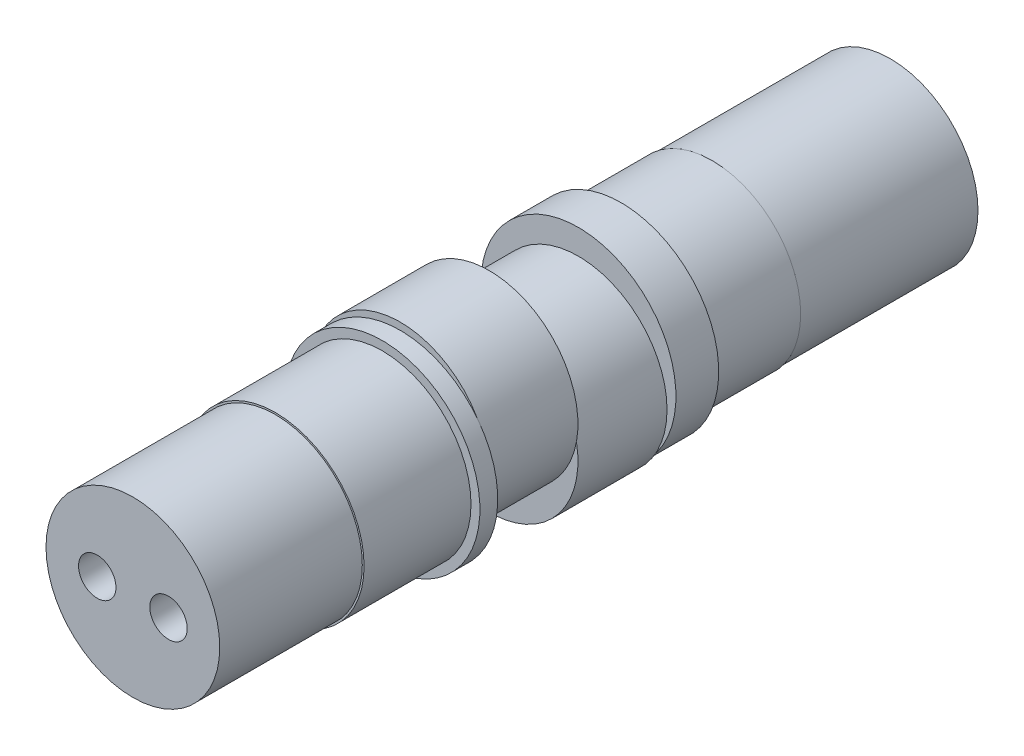
ISO-10303-21;
HEADER;
FILE_DESCRIPTION(('STEP AP214'),'2;1');
FILE_NAME('part.step','',(''),(''),'','','');
FILE_SCHEMA(('AUTOMOTIVE_DESIGN { 1 0 10303 214 1 1 1 1 }'));
ENDSEC;
DATA;
#1=APPLICATION_CONTEXT('core data for automotive mechanical design processes');
#2=APPLICATION_PROTOCOL_DEFINITION('international standard','automotive_design',2000,#1);
#3=PRODUCT_CONTEXT('',#1,'mechanical');
#4=PRODUCT('Part','Part','',(#3));
#5=PRODUCT_RELATED_PRODUCT_CATEGORY('part','',(#4));
#6=PRODUCT_DEFINITION_FORMATION('','',#4);
#7=PRODUCT_DEFINITION_CONTEXT('part definition',#1,'design');
#8=PRODUCT_DEFINITION('design','',#6,#7);
#9=PRODUCT_DEFINITION_SHAPE('','',#8);
#10=(LENGTH_UNIT() NAMED_UNIT(*) SI_UNIT(.MILLI.,.METRE.));
#11=(NAMED_UNIT(*) PLANE_ANGLE_UNIT() SI_UNIT($,.RADIAN.));
#12=(NAMED_UNIT(*) SI_UNIT($,.STERADIAN.) SOLID_ANGLE_UNIT());
#13=UNCERTAINTY_MEASURE_WITH_UNIT(LENGTH_MEASURE(1.E-05),#10,'distance_accuracy_value','');
#14=(GEOMETRIC_REPRESENTATION_CONTEXT(3) GLOBAL_UNCERTAINTY_ASSIGNED_CONTEXT((#13)) GLOBAL_UNIT_ASSIGNED_CONTEXT((#10,
#11,#12)) REPRESENTATION_CONTEXT('',''));
#15=CARTESIAN_POINT('',(0.,0.,0.));
#16=DIRECTION('',(0.,0.,1.));
#17=DIRECTION('',(1.,0.,0.));
#18=AXIS2_PLACEMENT_3D('',#15,#16,#17);
#19=CARTESIAN_POINT('',(-10.96,-23.586225741973,-27.5));
#20=DIRECTION('',(0.,0.,-1.));
#21=DIRECTION('',(-1.,0.,0.));
#22=AXIS2_PLACEMENT_3D('',#19,#20,#21);
#23=PLANE('',#22);
#24=CARTESIAN_POINT('',(4.,0.,-27.5));
#25=DIRECTION('',(0.,0.,-1.));
#26=DIRECTION('',(-1.,0.,0.));
#27=AXIS2_PLACEMENT_3D('',#24,#25,#26);
#28=CIRCLE('',#27,2.1);
#29=CARTESIAN_POINT('',(1.9,0.,-27.5));
#30=VERTEX_POINT('',#29);
#31=EDGE_CURVE('E91',#30,#30,#28,.F.);
#32=ORIENTED_EDGE('',*,*,#31,.T.);
#33=EDGE_LOOP('',(#32));
#34=FACE_BOUND('',#33,.T.);
#35=CARTESIAN_POINT('',(-4.,0.,-27.5));
#36=DIRECTION('',(0.,0.,-1.));
#37=DIRECTION('',(-1.,0.,0.));
#38=AXIS2_PLACEMENT_3D('',#35,#36,#37);
#39=CIRCLE('',#38,2.1);
#40=CARTESIAN_POINT('',(-6.1,0.,-27.5));
#41=VERTEX_POINT('',#40);
#42=EDGE_CURVE('E60',#41,#41,#39,.F.);
#43=ORIENTED_EDGE('',*,*,#42,.T.);
#44=EDGE_LOOP('',(#43));
#45=FACE_BOUND('',#44,.T.);
#46=CARTESIAN_POINT('',(0.,-1.8,-27.5));
#47=DIRECTION('',(0.,0.,1.));
#48=DIRECTION('',(1.,0.,0.));
#49=AXIS2_PLACEMENT_3D('',#46,#47,#48);
#50=CIRCLE('',#49,9.95);
#51=CARTESIAN_POINT('',(9.95,-1.8,-27.5));
#52=VERTEX_POINT('',#51);
#53=EDGE_CURVE('E94',#52,#52,#50,.T.);
#54=ORIENTED_EDGE('',*,*,#53,.F.);
#55=EDGE_LOOP('',(#54));
#56=FACE_BOUND('',#55,.T.);
#57=ADVANCED_FACE('F56',(#34,#45,#56),#23,.T.);
#58=CARTESIAN_POINT('',(-4.,0.,-42.5));
#59=DIRECTION('',(0.,0.,1.));
#60=DIRECTION('',(1.,0.,0.));
#61=AXIS2_PLACEMENT_3D('',#58,#59,#60);
#62=CYLINDRICAL_SURFACE('',#61,2.1);
#63=CARTESIAN_POINT('',(-4.,0.,-7.5));
#64=DIRECTION('',(0.,0.,-1.));
#65=DIRECTION('',(-1.,0.,0.));
#66=AXIS2_PLACEMENT_3D('',#63,#64,#65);
#67=CIRCLE('',#66,2.1);
#68=CARTESIAN_POINT('',(-6.1,0.,-7.5));
#69=VERTEX_POINT('',#68);
#70=EDGE_CURVE('E65',#69,#69,#67,.T.);
#71=ORIENTED_EDGE('',*,*,#70,.F.);
#72=EDGE_LOOP('',(#71));
#73=FACE_BOUND('',#72,.T.);
#74=ORIENTED_EDGE('',*,*,#42,.F.);
#75=EDGE_LOOP('',(#74));
#76=FACE_BOUND('',#75,.T.);
#77=ADVANCED_FACE('F108',(#73,#76),#62,.F.);
#78=CARTESIAN_POINT('',(4.,0.,-42.5));
#79=DIRECTION('',(0.,0.,1.));
#80=DIRECTION('',(1.,0.,0.));
#81=AXIS2_PLACEMENT_3D('',#78,#79,#80);
#82=CYLINDRICAL_SURFACE('',#81,2.1);
#83=CARTESIAN_POINT('',(4.,0.,-7.5));
#84=DIRECTION('',(0.,0.,-1.));
#85=DIRECTION('',(-1.,0.,0.));
#86=AXIS2_PLACEMENT_3D('',#83,#84,#85);
#87=CIRCLE('',#86,2.1);
#88=CARTESIAN_POINT('',(1.9,0.,-7.5));
#89=VERTEX_POINT('',#88);
#90=EDGE_CURVE('E12',#89,#89,#87,.T.);
#91=ORIENTED_EDGE('',*,*,#90,.F.);
#92=EDGE_LOOP('',(#91));
#93=FACE_BOUND('',#92,.T.);
#94=ORIENTED_EDGE('',*,*,#31,.F.);
#95=EDGE_LOOP('',(#94));
#96=FACE_BOUND('',#95,.T.);
#97=ADVANCED_FACE('F58',(#93,#96),#82,.F.);
#98=CARTESIAN_POINT('',(0.,1.8,-17.5));
#99=DIRECTION('',(0.,0.,-1.));
#100=DIRECTION('',(-1.,0.,0.));
#101=AXIS2_PLACEMENT_3D('',#98,#99,#100);
#102=PLANE('',#101);
#103=CARTESIAN_POINT('',(0.,-1.8,-17.5));
#104=DIRECTION('',(0.,0.,-1.));
#105=DIRECTION('',(-1.,0.,0.));
#106=AXIS2_PLACEMENT_3D('',#103,#104,#105);
#107=CIRCLE('',#106,9.95);
#108=CARTESIAN_POINT('',(9.78583159470875,0.,-17.5));
#109=VERTEX_POINT('',#108);
#110=CARTESIAN_POINT('',(-9.78583159470875,0.,-17.5));
#111=VERTEX_POINT('',#110);
#112=EDGE_CURVE('E83',#109,#111,#107,.T.);
#113=ORIENTED_EDGE('',*,*,#112,.F.);
#114=CARTESIAN_POINT('',(0.,1.8,-17.5));
#115=DIRECTION('',(0.,0.,-1.));
#116=DIRECTION('',(-1.,0.,0.));
#117=AXIS2_PLACEMENT_3D('',#114,#115,#116);
#118=CIRCLE('',#117,9.95);
#119=EDGE_CURVE('E72',#109,#111,#118,.T.);
#120=ORIENTED_EDGE('',*,*,#119,.T.);
#121=EDGE_LOOP('',(#113,#120));
#122=FACE_BOUND('',#121,.T.);
#123=ADVANCED_FACE('F90',(#122),#102,.F.);
#124=CARTESIAN_POINT('',(0.,1.8,-17.5));
#125=DIRECTION('',(0.,0.,-1.));
#126=DIRECTION('',(-1.,0.,0.));
#127=AXIS2_PLACEMENT_3D('',#124,#125,#126);
#128=PLANE('',#127);
#129=EDGE_CURVE('E77',#111,#109,#107,.T.);
#130=ORIENTED_EDGE('',*,*,#129,.F.);
#131=EDGE_CURVE('E79',#111,#109,#118,.T.);
#132=ORIENTED_EDGE('',*,*,#131,.T.);
#133=EDGE_LOOP('',(#130,#132));
#134=FACE_BOUND('',#133,.T.);
#135=ADVANCED_FACE('F78',(#134),#128,.T.);
#136=CARTESIAN_POINT('',(0.,-1.8,10.6428498912246));
#137=DIRECTION('',(0.,0.,-1.));
#138=DIRECTION('',(-1.,0.,0.));
#139=AXIS2_PLACEMENT_3D('',#136,#137,#138);
#140=CYLINDRICAL_SURFACE('',#139,9.95);
#141=ORIENTED_EDGE('',*,*,#129,.T.);
#142=ORIENTED_EDGE('',*,*,#112,.T.);
#143=EDGE_LOOP('',(#141,#142));
#144=FACE_BOUND('',#143,.T.);
#145=ORIENTED_EDGE('',*,*,#53,.T.);
#146=EDGE_LOOP('',(#145));
#147=FACE_BOUND('',#146,.T.);
#148=ADVANCED_FACE('F92',(#144,#147),#140,.T.);
#149=CARTESIAN_POINT('',(0.,1.8,-17.5));
#150=DIRECTION('',(0.,0.,1.));
#151=DIRECTION('',(1.,0.,0.));
#152=AXIS2_PLACEMENT_3D('',#149,#150,#151);
#153=CYLINDRICAL_SURFACE('',#152,9.95);
#154=ORIENTED_EDGE('',*,*,#119,.F.);
#155=ORIENTED_EDGE('',*,*,#131,.F.);
#156=EDGE_LOOP('',(#154,#155));
#157=FACE_BOUND('',#156,.T.);
#158=CARTESIAN_POINT('',(0.,1.8,-7.5));
#159=DIRECTION('',(0.,0.,-1.));
#160=DIRECTION('',(-1.,0.,0.));
#161=AXIS2_PLACEMENT_3D('',#158,#159,#160);
#162=CIRCLE('',#161,9.95);
#163=CARTESIAN_POINT('',(-9.95,1.8,-7.5));
#164=VERTEX_POINT('',#163);
#165=EDGE_CURVE('E84',#164,#164,#162,.T.);
#166=ORIENTED_EDGE('',*,*,#165,.T.);
#167=EDGE_LOOP('',(#166));
#168=FACE_BOUND('',#167,.T.);
#169=ADVANCED_FACE('F86',(#157,#168),#153,.T.);
#170=CARTESIAN_POINT('',(0.,1.8,-7.5));
#171=DIRECTION('',(0.,0.,-1.));
#172=DIRECTION('',(-1.,0.,0.));
#173=AXIS2_PLACEMENT_3D('',#170,#171,#172);
#174=PLANE('',#173);
#175=ORIENTED_EDGE('',*,*,#70,.T.);
#176=EDGE_LOOP('',(#175));
#177=FACE_BOUND('',#176,.T.);
#178=ORIENTED_EDGE('',*,*,#90,.T.);
#179=EDGE_LOOP('',(#178));
#180=FACE_BOUND('',#179,.T.);
#181=ORIENTED_EDGE('',*,*,#165,.F.);
#182=EDGE_LOOP('',(#181));
#183=FACE_BOUND('',#182,.T.);
#184=ADVANCED_FACE('F115',(#177,#180,#183),#174,.F.);
#185=CLOSED_SHELL('',(#57,#77,#97,#123,#135,#148,#169,#184));
#186=MANIFOLD_SOLID_BREP('B2',#185);
#187=CARTESIAN_POINT('',(0.,0.,-42.5));
#188=DIRECTION('',(0.,0.,-1.));
#189=DIRECTION('',(-1.,0.,0.));
#190=AXIS2_PLACEMENT_3D('',#187,#188,#189);
#191=PLANE('',#190);
#192=CARTESIAN_POINT('',(-4.,0.,-42.5));
#193=DIRECTION('',(0.,0.,1.));
#194=DIRECTION('',(1.,0.,0.));
#195=AXIS2_PLACEMENT_3D('',#192,#193,#194);
#196=CIRCLE('',#195,2.1);
#197=CARTESIAN_POINT('',(-1.9,0.,-42.5));
#198=VERTEX_POINT('',#197);
#199=EDGE_CURVE('E228',#198,#198,#196,.T.);
#200=ORIENTED_EDGE('',*,*,#199,.T.);
#201=EDGE_LOOP('',(#200));
#202=FACE_BOUND('',#201,.T.);
#203=ADVANCED_FACE('F196',(#202),#191,.F.);
#204=CARTESIAN_POINT('',(-4.,0.,-42.5));
#205=DIRECTION('',(0.,0.,1.));
#206=DIRECTION('',(1.,0.,0.));
#207=AXIS2_PLACEMENT_3D('',#204,#205,#206);
#208=CYLINDRICAL_SURFACE('',#207,2.1);
#209=CARTESIAN_POINT('',(-4.,0.,-27.5));
#210=DIRECTION('',(0.,0.,-1.));
#211=DIRECTION('',(-1.,0.,0.));
#212=AXIS2_PLACEMENT_3D('',#209,#210,#211);
#213=CIRCLE('',#212,2.1);
#214=CARTESIAN_POINT('',(-6.1,0.,-27.5));
#215=VERTEX_POINT('',#214);
#216=EDGE_CURVE('E204',#215,#215,#213,.F.);
#217=ORIENTED_EDGE('',*,*,#216,.T.);
#218=EDGE_LOOP('',(#217));
#219=FACE_BOUND('',#218,.T.);
#220=ORIENTED_EDGE('',*,*,#199,.F.);
#221=EDGE_LOOP('',(#220));
#222=FACE_BOUND('',#221,.T.);
#223=ADVANCED_FACE('F301',(#219,#222),#208,.F.);
#224=CARTESIAN_POINT('',(4.,0.,-42.5));
#225=DIRECTION('',(0.,0.,1.));
#226=DIRECTION('',(1.,0.,0.));
#227=AXIS2_PLACEMENT_3D('',#224,#225,#226);
#228=CIRCLE('',#227,2.1);
#229=CARTESIAN_POINT('',(6.1,0.,-42.5));
#230=VERTEX_POINT('',#229);
#231=EDGE_CURVE('E229',#230,#230,#228,.T.);
#232=ORIENTED_EDGE('',*,*,#231,.T.);
#233=EDGE_LOOP('',(#232));
#234=FACE_BOUND('',#233,.T.);
#235=ADVANCED_FACE('F303',(#234),#191,.F.);
#236=CARTESIAN_POINT('',(4.,0.,-42.5));
#237=DIRECTION('',(0.,0.,1.));
#238=DIRECTION('',(1.,0.,0.));
#239=AXIS2_PLACEMENT_3D('',#236,#237,#238);
#240=CYLINDRICAL_SURFACE('',#239,2.1);
#241=CARTESIAN_POINT('',(4.,0.,-27.5));
#242=DIRECTION('',(0.,0.,-1.));
#243=DIRECTION('',(-1.,0.,0.));
#244=AXIS2_PLACEMENT_3D('',#241,#242,#243);
#245=CIRCLE('',#244,2.1);
#246=CARTESIAN_POINT('',(1.9,0.,-27.5));
#247=VERTEX_POINT('',#246);
#248=EDGE_CURVE('E55',#247,#247,#245,.F.);
#249=ORIENTED_EDGE('',*,*,#248,.T.);
#250=EDGE_LOOP('',(#249));
#251=FACE_BOUND('',#250,.T.);
#252=ORIENTED_EDGE('',*,*,#231,.F.);
#253=EDGE_LOOP('',(#252));
#254=FACE_BOUND('',#253,.T.);
#255=ADVANCED_FACE('F310',(#251,#254),#240,.F.);
#256=CARTESIAN_POINT('',(0.,0.,-27.5));
#257=DIRECTION('',(0.,0.,-1.));
#258=DIRECTION('',(1.,0.,0.));
#259=AXIS2_PLACEMENT_3D('',#256,#257,#258);
#260=PLANE('',#259);
#261=CARTESIAN_POINT('',(0.,0.,-27.5));
#262=DIRECTION('',(0.,0.,-1.));
#263=DIRECTION('',(-1.,0.,0.));
#264=AXIS2_PLACEMENT_3D('',#261,#262,#263);
#265=CIRCLE('',#264,10.95);
#266=CARTESIAN_POINT('',(-10.95,0.,-27.5));
#267=VERTEX_POINT('',#266);
#268=EDGE_CURVE('E214',#267,#267,#265,.T.);
#269=ORIENTED_EDGE('',*,*,#268,.F.);
#270=EDGE_LOOP('',(#269));
#271=FACE_BOUND('',#270,.T.);
#272=ORIENTED_EDGE('',*,*,#216,.F.);
#273=EDGE_LOOP('',(#272));
#274=FACE_BOUND('',#273,.T.);
#275=ORIENTED_EDGE('',*,*,#248,.F.);
#276=EDGE_LOOP('',(#275));
#277=FACE_BOUND('',#276,.T.);
#278=ADVANCED_FACE('F313',(#271,#274,#277),#260,.F.);
#279=CARTESIAN_POINT('',(-3.75,3.75,-56.5));
#280=DIRECTION('',(0.,0.,-1.));
#281=DIRECTION('',(-1.,0.,0.));
#282=AXIS2_PLACEMENT_3D('',#279,#280,#281);
#283=PLANE('',#282);
#284=CARTESIAN_POINT('',(-3.75,3.75,-56.5));
#285=DIRECTION('',(0.,0.,-1.));
#286=DIRECTION('',(-1.,0.,0.));
#287=AXIS2_PLACEMENT_3D('',#284,#285,#286);
#288=CIRCLE('',#287,2.9);
#289=CARTESIAN_POINT('',(-6.65,3.75,-56.5));
#290=VERTEX_POINT('',#289);
#291=EDGE_CURVE('E244',#290,#290,#288,.T.);
#292=ORIENTED_EDGE('',*,*,#291,.T.);
#293=EDGE_LOOP('',(#292));
#294=FACE_BOUND('',#293,.T.);
#295=ADVANCED_FACE('F328',(#294),#283,.T.);
#296=CARTESIAN_POINT('',(3.75,-3.75,-56.5));
#297=DIRECTION('',(0.,0.,-1.));
#298=DIRECTION('',(-1.,0.,0.));
#299=AXIS2_PLACEMENT_3D('',#296,#297,#298);
#300=PLANE('',#299);
#301=CARTESIAN_POINT('',(3.75,-3.75,-56.5));
#302=DIRECTION('',(0.,0.,-1.));
#303=DIRECTION('',(-1.,0.,0.));
#304=AXIS2_PLACEMENT_3D('',#301,#302,#303);
#305=CIRCLE('',#304,2.9);
#306=CARTESIAN_POINT('',(0.85,-3.75,-56.5));
#307=VERTEX_POINT('',#306);
#308=EDGE_CURVE('E269',#307,#307,#305,.T.);
#309=ORIENTED_EDGE('',*,*,#308,.T.);
#310=EDGE_LOOP('',(#309));
#311=FACE_BOUND('',#310,.T.);
#312=ADVANCED_FACE('F334',(#311),#300,.T.);
#313=CARTESIAN_POINT('',(-3.75,-3.75,-56.5));
#314=DIRECTION('',(0.,0.,-1.));
#315=DIRECTION('',(-1.,0.,0.));
#316=AXIS2_PLACEMENT_3D('',#313,#314,#315);
#317=PLANE('',#316);
#318=CARTESIAN_POINT('',(-3.75,-3.75,-56.5));
#319=DIRECTION('',(0.,0.,-1.));
#320=DIRECTION('',(-1.,0.,0.));
#321=AXIS2_PLACEMENT_3D('',#318,#319,#320);
#322=CIRCLE('',#321,2.9);
#323=CARTESIAN_POINT('',(-6.65,-3.75,-56.5));
#324=VERTEX_POINT('',#323);
#325=EDGE_CURVE('E253',#324,#324,#322,.T.);
#326=ORIENTED_EDGE('',*,*,#325,.T.);
#327=EDGE_LOOP('',(#326));
#328=FACE_BOUND('',#327,.T.);
#329=ADVANCED_FACE('F347',(#328),#317,.T.);
#330=CARTESIAN_POINT('',(3.75,3.75,-56.5));
#331=DIRECTION('',(0.,0.,-1.));
#332=DIRECTION('',(-1.,0.,0.));
#333=AXIS2_PLACEMENT_3D('',#330,#331,#332);
#334=PLANE('',#333);
#335=CARTESIAN_POINT('',(3.75,3.75,-56.5));
#336=DIRECTION('',(0.,0.,-1.));
#337=DIRECTION('',(-1.,0.,0.));
#338=AXIS2_PLACEMENT_3D('',#335,#336,#337);
#339=CIRCLE('',#338,2.9);
#340=CARTESIAN_POINT('',(0.85,3.75,-56.5));
#341=VERTEX_POINT('',#340);
#342=EDGE_CURVE('E262',#341,#341,#339,.T.);
#343=ORIENTED_EDGE('',*,*,#342,.T.);
#344=EDGE_LOOP('',(#343));
#345=FACE_BOUND('',#344,.T.);
#346=ADVANCED_FACE('F355',(#345),#334,.T.);
#347=CARTESIAN_POINT('',(-3.75,3.75,-56.5));
#348=DIRECTION('',(0.,0.,-1.));
#349=DIRECTION('',(-1.,0.,0.));
#350=AXIS2_PLACEMENT_3D('',#347,#348,#349);
#351=CYLINDRICAL_SURFACE('',#350,2.9);
#352=ORIENTED_EDGE('',*,*,#291,.F.);
#353=EDGE_LOOP('',(#352));
#354=FACE_BOUND('',#353,.T.);
#355=CARTESIAN_POINT('',(-3.75,3.75,-62.5));
#356=DIRECTION('',(0.,0.,-1.));
#357=DIRECTION('',(-1.,0.,0.));
#358=AXIS2_PLACEMENT_3D('',#355,#356,#357);
#359=CIRCLE('',#358,2.9);
#360=CARTESIAN_POINT('',(-6.65,3.75,-62.5));
#361=VERTEX_POINT('',#360);
#362=EDGE_CURVE('E245',#361,#361,#359,.T.);
#363=ORIENTED_EDGE('',*,*,#362,.T.);
#364=EDGE_LOOP('',(#363));
#365=FACE_BOUND('',#364,.T.);
#366=ADVANCED_FACE('F353',(#354,#365),#351,.F.);
#367=CARTESIAN_POINT('',(3.75,-3.75,-56.5));
#368=DIRECTION('',(0.,0.,-1.));
#369=DIRECTION('',(-1.,0.,0.));
#370=AXIS2_PLACEMENT_3D('',#367,#368,#369);
#371=CYLINDRICAL_SURFACE('',#370,2.9);
#372=ORIENTED_EDGE('',*,*,#308,.F.);
#373=EDGE_LOOP('',(#372));
#374=FACE_BOUND('',#373,.T.);
#375=CARTESIAN_POINT('',(3.75,-3.75,-62.5));
#376=DIRECTION('',(0.,0.,-1.));
#377=DIRECTION('',(-1.,0.,0.));
#378=AXIS2_PLACEMENT_3D('',#375,#376,#377);
#379=CIRCLE('',#378,2.9);
#380=CARTESIAN_POINT('',(0.85,-3.75,-62.5));
#381=VERTEX_POINT('',#380);
#382=EDGE_CURVE('E258',#381,#381,#379,.T.);
#383=ORIENTED_EDGE('',*,*,#382,.T.);
#384=EDGE_LOOP('',(#383));
#385=FACE_BOUND('',#384,.T.);
#386=ADVANCED_FACE('F277',(#374,#385),#371,.F.);
#387=CARTESIAN_POINT('',(-3.75,-3.75,-56.5));
#388=DIRECTION('',(0.,0.,-1.));
#389=DIRECTION('',(-1.,0.,0.));
#390=AXIS2_PLACEMENT_3D('',#387,#388,#389);
#391=CYLINDRICAL_SURFACE('',#390,2.9);
#392=ORIENTED_EDGE('',*,*,#325,.F.);
#393=EDGE_LOOP('',(#392));
#394=FACE_BOUND('',#393,.T.);
#395=CARTESIAN_POINT('',(-3.75,-3.75,-62.5));
#396=DIRECTION('',(0.,0.,-1.));
#397=DIRECTION('',(-1.,0.,0.));
#398=AXIS2_PLACEMENT_3D('',#395,#396,#397);
#399=CIRCLE('',#398,2.9);
#400=CARTESIAN_POINT('',(-6.65,-3.75,-62.5));
#401=VERTEX_POINT('',#400);
#402=EDGE_CURVE('E257',#401,#401,#399,.T.);
#403=ORIENTED_EDGE('',*,*,#402,.T.);
#404=EDGE_LOOP('',(#403));
#405=FACE_BOUND('',#404,.T.);
#406=ADVANCED_FACE('F360',(#394,#405),#391,.F.);
#407=CARTESIAN_POINT('',(3.75,3.75,-56.5));
#408=DIRECTION('',(0.,0.,-1.));
#409=DIRECTION('',(-1.,0.,0.));
#410=AXIS2_PLACEMENT_3D('',#407,#408,#409);
#411=CYLINDRICAL_SURFACE('',#410,2.9);
#412=ORIENTED_EDGE('',*,*,#342,.F.);
#413=EDGE_LOOP('',(#412));
#414=FACE_BOUND('',#413,.T.);
#415=CARTESIAN_POINT('',(3.75,3.75,-62.5));
#416=DIRECTION('',(0.,0.,-1.));
#417=DIRECTION('',(-1.,0.,0.));
#418=AXIS2_PLACEMENT_3D('',#415,#416,#417);
#419=CIRCLE('',#418,2.9);
#420=CARTESIAN_POINT('',(0.85,3.75,-62.5));
#421=VERTEX_POINT('',#420);
#422=EDGE_CURVE('E249',#421,#421,#419,.T.);
#423=ORIENTED_EDGE('',*,*,#422,.T.);
#424=EDGE_LOOP('',(#423));
#425=FACE_BOUND('',#424,.T.);
#426=ADVANCED_FACE('F283',(#414,#425),#411,.F.);
#427=CARTESIAN_POINT('',(0.,9.85,-62.5));
#428=DIRECTION('',(0.,0.,1.));
#429=DIRECTION('',(1.,0.,0.));
#430=AXIS2_PLACEMENT_3D('',#427,#428,#429);
#431=PLANE('',#430);
#432=ORIENTED_EDGE('',*,*,#422,.F.);
#433=EDGE_LOOP('',(#432));
#434=FACE_BOUND('',#433,.T.);
#435=ORIENTED_EDGE('',*,*,#402,.F.);
#436=EDGE_LOOP('',(#435));
#437=FACE_BOUND('',#436,.T.);
#438=ORIENTED_EDGE('',*,*,#382,.F.);
#439=EDGE_LOOP('',(#438));
#440=FACE_BOUND('',#439,.T.);
#441=ORIENTED_EDGE('',*,*,#362,.F.);
#442=EDGE_LOOP('',(#441));
#443=FACE_BOUND('',#442,.T.);
#444=CARTESIAN_POINT('',(0.,0.,-62.5));
#445=DIRECTION('',(0.,0.,1.));
#446=DIRECTION('',(1.,0.,0.));
#447=AXIS2_PLACEMENT_3D('',#444,#445,#446);
#448=CIRCLE('',#447,9.85);
#449=CARTESIAN_POINT('',(9.85,0.,-62.5));
#450=VERTEX_POINT('',#449);
#451=EDGE_CURVE('E233',#450,#450,#448,.T.);
#452=ORIENTED_EDGE('',*,*,#451,.F.);
#453=EDGE_LOOP('',(#452));
#454=FACE_BOUND('',#453,.T.);
#455=ADVANCED_FACE('F279',(#434,#437,#440,#443,#454),#431,.F.);
#456=CARTESIAN_POINT('',(0.,0.,15.3066483819548));
#457=DIRECTION('',(0.,0.,1.));
#458=DIRECTION('',(1.,0.,0.));
#459=AXIS2_PLACEMENT_3D('',#456,#457,#458);
#460=CYLINDRICAL_SURFACE('',#459,9.85);
#461=CARTESIAN_POINT('',(0.,0.,-42.5));
#462=DIRECTION('',(0.,0.,1.));
#463=DIRECTION('',(1.,0.,0.));
#464=AXIS2_PLACEMENT_3D('',#461,#462,#463);
#465=CIRCLE('',#464,9.85);
#466=CARTESIAN_POINT('',(9.85,0.,-42.5));
#467=VERTEX_POINT('',#466);
#468=EDGE_CURVE('E240',#467,#467,#465,.T.);
#469=ORIENTED_EDGE('',*,*,#468,.F.);
#470=EDGE_LOOP('',(#469));
#471=FACE_BOUND('',#470,.T.);
#472=ORIENTED_EDGE('',*,*,#451,.T.);
#473=EDGE_LOOP('',(#472));
#474=FACE_BOUND('',#473,.T.);
#475=ADVANCED_FACE('F282',(#471,#474),#460,.T.);
#476=CARTESIAN_POINT('',(0.,0.,-42.5));
#477=DIRECTION('',(0.,0.,-1.));
#478=DIRECTION('',(1.,0.,0.));
#479=AXIS2_PLACEMENT_3D('',#476,#477,#478);
#480=PLANE('',#479);
#481=ORIENTED_EDGE('',*,*,#468,.T.);
#482=EDGE_LOOP('',(#481));
#483=FACE_BOUND('',#482,.T.);
#484=CARTESIAN_POINT('',(0.,0.,-42.5));
#485=DIRECTION('',(0.,0.,1.));
#486=DIRECTION('',(1.,0.,0.));
#487=AXIS2_PLACEMENT_3D('',#484,#485,#486);
#488=CIRCLE('',#487,9.95);
#489=CARTESIAN_POINT('',(9.95,0.,-42.5));
#490=VERTEX_POINT('',#489);
#491=EDGE_CURVE('E209',#490,#490,#488,.T.);
#492=ORIENTED_EDGE('',*,*,#491,.F.);
#493=EDGE_LOOP('',(#492));
#494=FACE_BOUND('',#493,.T.);
#495=ADVANCED_FACE('F291',(#483,#494),#480,.T.);
#496=CARTESIAN_POINT('',(0.,0.,-42.5));
#497=DIRECTION('',(0.,0.,1.));
#498=DIRECTION('',(-1.,0.,0.));
#499=AXIS2_PLACEMENT_3D('',#496,#497,#498);
#500=CYLINDRICAL_SURFACE('',#499,9.95);
#501=CARTESIAN_POINT('',(0.,0.,-32.3));
#502=DIRECTION('',(0.,0.,-1.));
#503=DIRECTION('',(-1.,0.,0.));
#504=AXIS2_PLACEMENT_3D('',#501,#502,#503);
#505=CIRCLE('',#504,9.95);
#506=CARTESIAN_POINT('',(-9.95,0.,-32.3));
#507=VERTEX_POINT('',#506);
#508=EDGE_CURVE('E217',#507,#507,#505,.T.);
#509=ORIENTED_EDGE('',*,*,#508,.T.);
#510=EDGE_LOOP('',(#509));
#511=FACE_BOUND('',#510,.T.);
#512=ORIENTED_EDGE('',*,*,#491,.T.);
#513=EDGE_LOOP('',(#512));
#514=FACE_BOUND('',#513,.T.);
#515=ADVANCED_FACE('F198',(#511,#514),#500,.T.);
#516=CARTESIAN_POINT('',(0.,0.,-32.3));
#517=DIRECTION('',(0.,0.,-1.));
#518=DIRECTION('',(-1.,0.,0.));
#519=AXIS2_PLACEMENT_3D('',#516,#517,#518);
#520=PLANE('',#519);
#521=ORIENTED_EDGE('',*,*,#508,.F.);
#522=EDGE_LOOP('',(#521));
#523=FACE_BOUND('',#522,.T.);
#524=CARTESIAN_POINT('',(0.,0.,-32.3));
#525=DIRECTION('',(0.,0.,-1.));
#526=DIRECTION('',(-1.,0.,0.));
#527=AXIS2_PLACEMENT_3D('',#524,#525,#526);
#528=CIRCLE('',#527,10.95);
#529=CARTESIAN_POINT('',(-10.95,0.,-32.3));
#530=VERTEX_POINT('',#529);
#531=EDGE_CURVE('E220',#530,#530,#528,.T.);
#532=ORIENTED_EDGE('',*,*,#531,.T.);
#533=EDGE_LOOP('',(#532));
#534=FACE_BOUND('',#533,.T.);
#535=ADVANCED_FACE('F320',(#523,#534),#520,.T.);
#536=CARTESIAN_POINT('',(0.,0.,-29.5));
#537=DIRECTION('',(0.,0.,1.));
#538=DIRECTION('',(-1.,0.,0.));
#539=AXIS2_PLACEMENT_3D('',#536,#537,#538);
#540=CYLINDRICAL_SURFACE('',#539,10.95);
#541=ORIENTED_EDGE('',*,*,#268,.T.);
#542=EDGE_LOOP('',(#541));
#543=FACE_BOUND('',#542,.T.);
#544=ORIENTED_EDGE('',*,*,#531,.F.);
#545=EDGE_LOOP('',(#544));
#546=FACE_BOUND('',#545,.T.);
#547=ADVANCED_FACE('F323',(#543,#546),#540,.T.);
#548=CLOSED_SHELL('',(#203,#223,#235,#255,#278,#295,#312,#329,#346,#366,#386,#406,#426,#455,
#475,#495,#515,#535,#547));
#549=MANIFOLD_SOLID_BREP('B6',#548);
#550=CARTESIAN_POINT('',(0.,0.,7.5));
#551=DIRECTION('',(0.,0.,-1.));
#552=DIRECTION('',(-1.,0.,0.));
#553=AXIS2_PLACEMENT_3D('',#550,#551,#552);
#554=CYLINDRICAL_SURFACE('',#553,9.95);
#555=CARTESIAN_POINT('',(0.,0.,-5.5));
#556=DIRECTION('',(0.,0.,-1.));
#557=DIRECTION('',(-1.,0.,0.));
#558=AXIS2_PLACEMENT_3D('',#555,#556,#557);
#559=CIRCLE('',#558,9.95);
#560=CARTESIAN_POINT('',(-9.95,0.,-5.5));
#561=VERTEX_POINT('',#560);
#562=EDGE_CURVE('E195',#561,#561,#559,.T.);
#563=ORIENTED_EDGE('',*,*,#562,.F.);
#564=EDGE_LOOP('',(#563));
#565=FACE_BOUND('',#564,.T.);
#566=CARTESIAN_POINT('',(0.,0.,6.5));
#567=DIRECTION('',(0.,0.,1.));
#568=DIRECTION('',(1.,0.,0.));
#569=AXIS2_PLACEMENT_3D('',#566,#567,#568);
#570=CIRCLE('',#569,9.95);
#571=CARTESIAN_POINT('',(9.95,0.,6.5));
#572=VERTEX_POINT('',#571);
#573=EDGE_CURVE('E530',#572,#572,#570,.T.);
#574=ORIENTED_EDGE('',*,*,#573,.F.);
#575=EDGE_LOOP('',(#574));
#576=FACE_BOUND('',#575,.T.);
#577=ADVANCED_FACE('F503',(#565,#576),#554,.T.);
#578=CARTESIAN_POINT('',(0.,0.,22.5));
#579=DIRECTION('',(0.,0.,1.));
#580=DIRECTION('',(1.,0.,0.));
#581=AXIS2_PLACEMENT_3D('',#578,#579,#580);
#582=PLANE('',#581);
#583=CARTESIAN_POINT('',(-4.,0.,22.5));
#584=DIRECTION('',(0.,0.,1.));
#585=DIRECTION('',(1.,0.,0.));
#586=AXIS2_PLACEMENT_3D('',#583,#584,#585);
#587=CIRCLE('',#586,2.1);
#588=CARTESIAN_POINT('',(-1.9,0.,22.5));
#589=VERTEX_POINT('',#588);
#590=EDGE_CURVE('E520',#589,#589,#587,.F.);
#591=ORIENTED_EDGE('',*,*,#590,.T.);
#592=EDGE_LOOP('',(#591));
#593=FACE_BOUND('',#592,.T.);
#594=CARTESIAN_POINT('',(4.,0.,22.5));
#595=DIRECTION('',(0.,0.,1.));
#596=DIRECTION('',(1.,0.,0.));
#597=AXIS2_PLACEMENT_3D('',#594,#595,#596);
#598=CIRCLE('',#597,2.1);
#599=CARTESIAN_POINT('',(6.1,0.,22.5));
#600=VERTEX_POINT('',#599);
#601=EDGE_CURVE('E525',#600,#600,#598,.F.);
#602=ORIENTED_EDGE('',*,*,#601,.T.);
#603=EDGE_LOOP('',(#602));
#604=FACE_BOUND('',#603,.T.);
#605=CARTESIAN_POINT('',(0.,0.,22.5));
#606=DIRECTION('',(0.,0.,1.));
#607=DIRECTION('',(1.,0.,0.));
#608=AXIS2_PLACEMENT_3D('',#605,#606,#607);
#609=CIRCLE('',#608,9.75);
#610=CARTESIAN_POINT('',(9.75,0.,22.5));
#611=VERTEX_POINT('',#610);
#612=EDGE_CURVE('E536',#611,#611,#609,.T.);
#613=ORIENTED_EDGE('',*,*,#612,.T.);
#614=EDGE_LOOP('',(#613));
#615=FACE_BOUND('',#614,.T.);
#616=ADVANCED_FACE('F553',(#593,#604,#615),#582,.T.);
#617=CARTESIAN_POINT('',(0.,0.,-5.5));
#618=DIRECTION('',(0.,0.,-1.));
#619=DIRECTION('',(-1.,0.,0.));
#620=AXIS2_PLACEMENT_3D('',#617,#618,#619);
#621=CYLINDRICAL_SURFACE('',#620,10.95);
#622=CARTESIAN_POINT('',(0.,0.,-5.5));
#623=DIRECTION('',(0.,0.,-1.));
#624=DIRECTION('',(-1.,0.,0.));
#625=AXIS2_PLACEMENT_3D('',#622,#623,#624);
#626=CIRCLE('',#625,10.95);
#627=CARTESIAN_POINT('',(-10.95,0.,-5.5));
#628=VERTEX_POINT('',#627);
#629=EDGE_CURVE('E510',#628,#628,#626,.T.);
#630=ORIENTED_EDGE('',*,*,#629,.T.);
#631=EDGE_LOOP('',(#630));
#632=FACE_BOUND('',#631,.T.);
#633=CARTESIAN_POINT('',(0.,0.,-7.5));
#634=DIRECTION('',(0.,0.,-1.));
#635=DIRECTION('',(-1.,0.,0.));
#636=AXIS2_PLACEMENT_3D('',#633,#634,#635);
#637=CIRCLE('',#636,10.95);
#638=CARTESIAN_POINT('',(-10.95,0.,-7.5));
#639=VERTEX_POINT('',#638);
#640=EDGE_CURVE('E515',#639,#639,#637,.T.);
#641=ORIENTED_EDGE('',*,*,#640,.F.);
#642=EDGE_LOOP('',(#641));
#643=FACE_BOUND('',#642,.T.);
#644=ADVANCED_FACE('F559',(#632,#643),#621,.T.);
#645=CARTESIAN_POINT('',(0.,0.,-5.5));
#646=DIRECTION('',(0.,0.,-1.));
#647=DIRECTION('',(-1.,0.,0.));
#648=AXIS2_PLACEMENT_3D('',#645,#646,#647);
#649=PLANE('',#648);
#650=ORIENTED_EDGE('',*,*,#562,.T.);
#651=EDGE_LOOP('',(#650));
#652=FACE_BOUND('',#651,.T.);
#653=ORIENTED_EDGE('',*,*,#629,.F.);
#654=EDGE_LOOP('',(#653));
#655=FACE_BOUND('',#654,.T.);
#656=ADVANCED_FACE('F572',(#652,#655),#649,.F.);
#657=CARTESIAN_POINT('',(4.,0.,-42.5));
#658=DIRECTION('',(0.,0.,1.));
#659=DIRECTION('',(1.,0.,0.));
#660=AXIS2_PLACEMENT_3D('',#657,#658,#659);
#661=CYLINDRICAL_SURFACE('',#660,2.1);
#662=CARTESIAN_POINT('',(4.,0.,-7.5));
#663=DIRECTION('',(0.,0.,1.));
#664=DIRECTION('',(1.,0.,0.));
#665=AXIS2_PLACEMENT_3D('',#662,#663,#664);
#666=CIRCLE('',#665,2.1);
#667=CARTESIAN_POINT('',(6.1,0.,-7.5));
#668=VERTEX_POINT('',#667);
#669=EDGE_CURVE('E518',#668,#668,#666,.T.);
#670=ORIENTED_EDGE('',*,*,#669,.F.);
#671=EDGE_LOOP('',(#670));
#672=FACE_BOUND('',#671,.T.);
#673=ORIENTED_EDGE('',*,*,#601,.F.);
#674=EDGE_LOOP('',(#673));
#675=FACE_BOUND('',#674,.T.);
#676=ADVANCED_FACE('F576',(#672,#675),#661,.F.);
#677=CARTESIAN_POINT('',(-4.,0.,-42.5));
#678=DIRECTION('',(0.,0.,1.));
#679=DIRECTION('',(1.,0.,0.));
#680=AXIS2_PLACEMENT_3D('',#677,#678,#679);
#681=CYLINDRICAL_SURFACE('',#680,2.1);
#682=CARTESIAN_POINT('',(-4.,0.,-7.5));
#683=DIRECTION('',(0.,0.,1.));
#684=DIRECTION('',(1.,0.,0.));
#685=AXIS2_PLACEMENT_3D('',#682,#683,#684);
#686=CIRCLE('',#685,2.1);
#687=CARTESIAN_POINT('',(-1.9,0.,-7.5));
#688=VERTEX_POINT('',#687);
#689=EDGE_CURVE('E506',#688,#688,#686,.T.);
#690=ORIENTED_EDGE('',*,*,#689,.F.);
#691=EDGE_LOOP('',(#690));
#692=FACE_BOUND('',#691,.T.);
#693=ORIENTED_EDGE('',*,*,#590,.F.);
#694=EDGE_LOOP('',(#693));
#695=FACE_BOUND('',#694,.T.);
#696=ADVANCED_FACE('F548',(#692,#695),#681,.F.);
#697=CARTESIAN_POINT('',(0.,0.,6.5));
#698=DIRECTION('',(0.,0.,1.));
#699=DIRECTION('',(1.,0.,0.));
#700=AXIS2_PLACEMENT_3D('',#697,#698,#699);
#701=PLANE('',#700);
#702=CARTESIAN_POINT('',(0.,0.,6.5));
#703=DIRECTION('',(0.,0.,1.));
#704=DIRECTION('',(1.,0.,0.));
#705=AXIS2_PLACEMENT_3D('',#702,#703,#704);
#706=CIRCLE('',#705,9.75);
#707=CARTESIAN_POINT('',(9.75,0.,6.5));
#708=VERTEX_POINT('',#707);
#709=EDGE_CURVE('E535',#708,#708,#706,.T.);
#710=ORIENTED_EDGE('',*,*,#709,.F.);
#711=EDGE_LOOP('',(#710));
#712=FACE_BOUND('',#711,.T.);
#713=ORIENTED_EDGE('',*,*,#573,.T.);
#714=EDGE_LOOP('',(#713));
#715=FACE_BOUND('',#714,.T.);
#716=ADVANCED_FACE('F545',(#712,#715),#701,.T.);
#717=CARTESIAN_POINT('',(0.,0.,6.5));
#718=DIRECTION('',(0.,0.,1.));
#719=DIRECTION('',(1.,0.,0.));
#720=AXIS2_PLACEMENT_3D('',#717,#718,#719);
#721=CYLINDRICAL_SURFACE('',#720,9.75);
#722=ORIENTED_EDGE('',*,*,#709,.T.);
#723=EDGE_LOOP('',(#722));
#724=FACE_BOUND('',#723,.T.);
#725=ORIENTED_EDGE('',*,*,#612,.F.);
#726=EDGE_LOOP('',(#725));
#727=FACE_BOUND('',#726,.T.);
#728=ADVANCED_FACE('F542',(#724,#727),#721,.T.);
#729=CARTESIAN_POINT('',(0.,0.,-7.5));
#730=DIRECTION('',(0.,0.,1.));
#731=DIRECTION('',(1.,0.,0.));
#732=AXIS2_PLACEMENT_3D('',#729,#730,#731);
#733=PLANE('',#732);
#734=ORIENTED_EDGE('',*,*,#689,.T.);
#735=EDGE_LOOP('',(#734));
#736=FACE_BOUND('',#735,.T.);
#737=ORIENTED_EDGE('',*,*,#669,.T.);
#738=EDGE_LOOP('',(#737));
#739=FACE_BOUND('',#738,.T.);
#740=ORIENTED_EDGE('',*,*,#640,.T.);
#741=EDGE_LOOP('',(#740));
#742=FACE_BOUND('',#741,.T.);
#743=ADVANCED_FACE('F555',(#736,#739,#742),#733,.F.);
#744=CLOSED_SHELL('',(#577,#616,#644,#656,#676,#696,#716,#728,#743));
#745=MANIFOLD_SOLID_BREP('B50',#744);
#746=ADVANCED_BREP_SHAPE_REPRESENTATION('',(#18,#186,#549,#745),#14);
#747=SHAPE_DEFINITION_REPRESENTATION(#9,#746);
ENDSEC;
END-ISO-10303-21;
